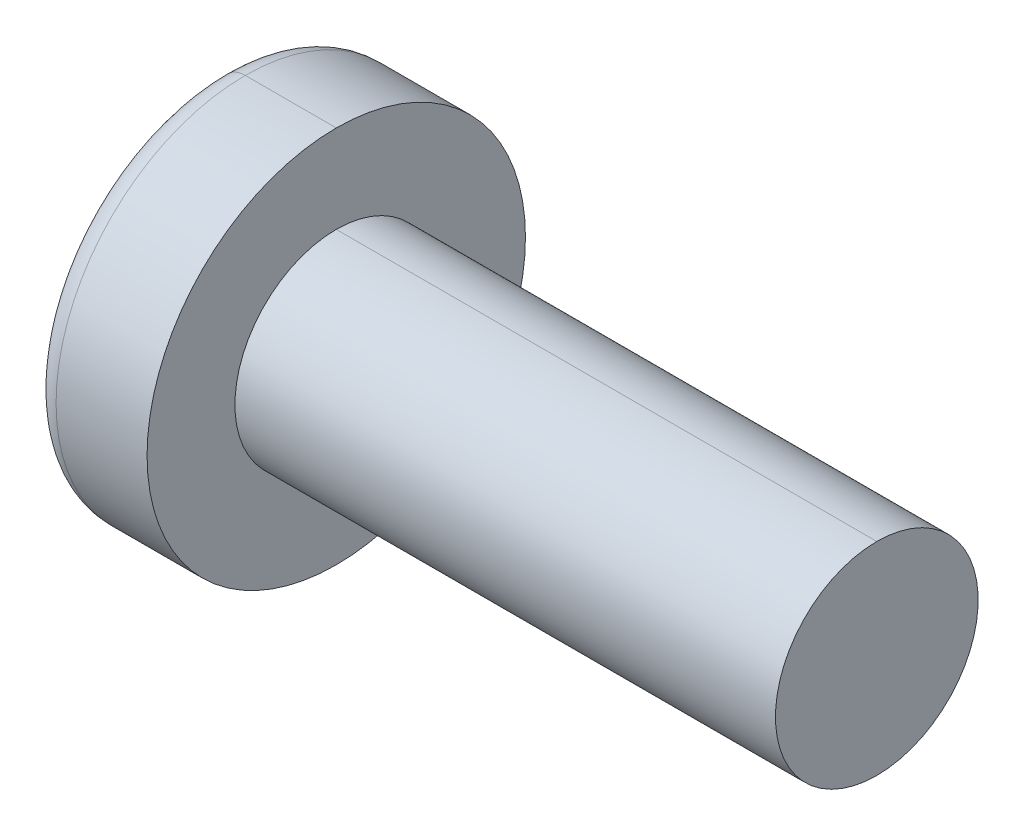
ISO-10303-21;
HEADER;
FILE_DESCRIPTION(('STEP AP214'),'2;1');
FILE_NAME('part.step','',(''),(''),'','','');
FILE_SCHEMA(('AUTOMOTIVE_DESIGN { 1 0 10303 214 1 1 1 1 }'));
ENDSEC;
DATA;
#1=APPLICATION_CONTEXT('core data for automotive mechanical design processes');
#2=APPLICATION_PROTOCOL_DEFINITION('international standard','automotive_design',2000,#1);
#3=PRODUCT_CONTEXT('',#1,'mechanical');
#4=PRODUCT('Part','Part','',(#3));
#5=PRODUCT_RELATED_PRODUCT_CATEGORY('part','',(#4));
#6=PRODUCT_DEFINITION_FORMATION('','',#4);
#7=PRODUCT_DEFINITION_CONTEXT('part definition',#1,'design');
#8=PRODUCT_DEFINITION('design','',#6,#7);
#9=PRODUCT_DEFINITION_SHAPE('','',#8);
#10=(LENGTH_UNIT() NAMED_UNIT(*) SI_UNIT(.MILLI.,.METRE.));
#11=(NAMED_UNIT(*) PLANE_ANGLE_UNIT() SI_UNIT($,.RADIAN.));
#12=(NAMED_UNIT(*) SI_UNIT($,.STERADIAN.) SOLID_ANGLE_UNIT());
#13=UNCERTAINTY_MEASURE_WITH_UNIT(LENGTH_MEASURE(1.E-05),#10,'distance_accuracy_value','');
#14=(GEOMETRIC_REPRESENTATION_CONTEXT(3) GLOBAL_UNCERTAINTY_ASSIGNED_CONTEXT((#13)) GLOBAL_UNIT_ASSIGNED_CONTEXT((#10,
#11,#12)) REPRESENTATION_CONTEXT('',''));
#15=CARTESIAN_POINT('',(0.,0.,0.));
#16=DIRECTION('',(0.,0.,1.));
#17=DIRECTION('',(1.,0.,0.));
#18=AXIS2_PLACEMENT_3D('',#15,#16,#17);
#19=CARTESIAN_POINT('',(-0.382608695652,0.,-0.157944664032));
#20=DIRECTION('',(-0.104537710695992,0.,0.994520923380922));
#21=DIRECTION('',(0.,1.,0.));
#22=AXIS2_PLACEMENT_3D('',#19,#20,#21);
#23=PLANE('',#22);
#24=DIRECTION('',(0.989130931836583,0.103971149084956,0.103971149084956));
#25=VECTOR('',#24,1.);
#26=CARTESIAN_POINT('',(-2.372965865668,-0.367158343834,-0.367158343834));
#27=LINE('',#26,#25);
#28=CARTESIAN_POINT('',(-2.372965865669,-0.367158343834,-0.367158343834));
#29=VERTEX_POINT('',#28);
#30=CARTESIAN_POINT('',(-0.639999999999,-0.185,-0.185));
#31=VERTEX_POINT('',#30);
#32=EDGE_CURVE('E11',#29,#31,#27,.T.);
#33=ORIENTED_EDGE('',*,*,#32,.F.);
#34=CARTESIAN_POINT('',(2.583826363223,0.,0.153868112042));
#35=DIRECTION('',(-0.10453771069617,0.,0.994520923380903));
#36=DIRECTION('',(-0.991833389461053,-0.073466848683124,-0.104255214233006));
#37=AXIS2_PLACEMENT_3D('',#34,#35,#36);
#38=CIRCLE('',#37,4.997605728503);
#39=CARTESIAN_POINT('',(-2.211403861538,-1.314446525481,-0.350175974082));
#40=VERTEX_POINT('',#39);
#41=EDGE_CURVE('E158',#29,#40,#38,.T.);
#42=ORIENTED_EDGE('',*,*,#41,.T.);
#43=DIRECTION('',(-0.80907355338871,-0.581521616497791,-0.0850446632820795));
#44=VECTOR('',#43,1.);
#45=CARTESIAN_POINT('',(-0.639999999999,-0.185,-0.185));
#46=LINE('',#45,#44);
#47=EDGE_CURVE('E161',#31,#40,#46,.T.);
#48=ORIENTED_EDGE('',*,*,#47,.F.);
#49=EDGE_LOOP('',(#33,#42,#48));
#50=FACE_BOUND('',#49,.T.);
#51=ADVANCED_FACE('F17',(#50),#23,.T.);
#52=CARTESIAN_POINT('',(-0.382608695652,-0.157944664032,0.));
#53=DIRECTION('',(-0.104537710695992,0.994520923380922,0.));
#54=DIRECTION('',(0.,0.,1.));
#55=AXIS2_PLACEMENT_3D('',#52,#53,#54);
#56=PLANE('',#55);
#57=DIRECTION('',(-0.80907355338871,-0.0850446632820795,-0.581521616497791));
#58=VECTOR('',#57,1.);
#59=CARTESIAN_POINT('',(-0.639999999999,-0.185,-0.185));
#60=LINE('',#59,#58);
#61=CARTESIAN_POINT('',(-2.211403861539,-0.350175974082,-1.314446525481));
#62=VERTEX_POINT('',#61);
#63=EDGE_CURVE('E251',#31,#62,#60,.T.);
#64=ORIENTED_EDGE('',*,*,#63,.T.);
#65=CARTESIAN_POINT('',(2.583826363223,0.153868112042,0.));
#66=DIRECTION('',(-0.104537710695979,0.994520923380923,0.));
#67=DIRECTION('',(-0.95950550829011,-0.100857113087012,-0.26301525108003));
#68=AXIS2_PLACEMENT_3D('',#65,#66,#67);
#69=CIRCLE('',#68,4.997605728503);
#70=EDGE_CURVE('E165',#62,#29,#69,.T.);
#71=ORIENTED_EDGE('',*,*,#70,.T.);
#72=ORIENTED_EDGE('',*,*,#32,.T.);
#73=EDGE_LOOP('',(#64,#71,#72));
#74=FACE_BOUND('',#73,.T.);
#75=ADVANCED_FACE('F330',(#74),#56,.T.);
#76=CARTESIAN_POINT('',(-0.382608695652,0.,-0.157944664032));
#77=DIRECTION('',(-0.104537710695992,0.,0.994520923380922));
#78=DIRECTION('',(0.,1.,0.));
#79=AXIS2_PLACEMENT_3D('',#76,#77,#78);
#80=PLANE('',#79);
#81=DIRECTION('',(-0.989130931836583,0.103971149084956,-0.103971149084956));
#82=VECTOR('',#81,1.);
#83=CARTESIAN_POINT('',(-0.639999999999,0.185,-0.185));
#84=LINE('',#83,#82);
#85=CARTESIAN_POINT('',(-0.639999999999,0.185,-0.185));
#86=VERTEX_POINT('',#85);
#87=CARTESIAN_POINT('',(-2.372965865669,0.367158343834,-0.367158343834));
#88=VERTEX_POINT('',#87);
#89=EDGE_CURVE('E28',#86,#88,#84,.T.);
#90=ORIENTED_EDGE('',*,*,#89,.F.);
#91=DIRECTION('',(-0.80907355338871,0.581521616497791,-0.0850446632820795));
#92=VECTOR('',#91,1.);
#93=CARTESIAN_POINT('',(-0.639999999999,0.185,-0.185));
#94=LINE('',#93,#92);
#95=CARTESIAN_POINT('',(-2.211403861539,1.314446525481,-0.350175974082));
#96=VERTEX_POINT('',#95);
#97=EDGE_CURVE('E238',#86,#96,#94,.T.);
#98=ORIENTED_EDGE('',*,*,#97,.T.);
#99=CARTESIAN_POINT('',(2.583826363223,0.,0.153868112042));
#100=DIRECTION('',(-0.104537710695979,0.,0.994520923380923));
#101=DIRECTION('',(-0.95950550829011,0.26301525108003,-0.100857113087012));
#102=AXIS2_PLACEMENT_3D('',#99,#100,#101);
#103=CIRCLE('',#102,4.997605728503);
#104=EDGE_CURVE('E237',#96,#88,#103,.T.);
#105=ORIENTED_EDGE('',*,*,#104,.T.);
#106=EDGE_LOOP('',(#90,#98,#105));
#107=FACE_BOUND('',#106,.T.);
#108=ADVANCED_FACE('F655',(#107),#80,.T.);
#109=CARTESIAN_POINT('',(-0.382608695652,0.157944664032,0.));
#110=DIRECTION('',(-0.104537710695992,-0.994520923380922,0.));
#111=DIRECTION('',(-0.994520923380922,0.104537710695992,0.));
#112=AXIS2_PLACEMENT_3D('',#109,#110,#111);
#113=PLANE('',#112);
#114=ORIENTED_EDGE('',*,*,#89,.T.);
#115=CARTESIAN_POINT('',(2.583826363223,-0.153868112042,0.));
#116=DIRECTION('',(-0.10453771069617,-0.994520923380903,0.));
#117=DIRECTION('',(-0.991833389461053,0.104255214233006,-0.073466848683124));
#118=AXIS2_PLACEMENT_3D('',#115,#116,#117);
#119=CIRCLE('',#118,4.997605728503);
#120=CARTESIAN_POINT('',(-2.211403861538,0.350175974082,-1.314446525481));
#121=VERTEX_POINT('',#120);
#122=EDGE_CURVE('E259',#88,#121,#119,.T.);
#123=ORIENTED_EDGE('',*,*,#122,.T.);
#124=DIRECTION('',(-0.809073553388711,0.0850446632820696,-0.581521616497792));
#125=VECTOR('',#124,1.);
#126=CARTESIAN_POINT('',(-0.639999999999,0.185,-0.185));
#127=LINE('',#126,#125);
#128=EDGE_CURVE('E254',#86,#121,#127,.T.);
#129=ORIENTED_EDGE('',*,*,#128,.F.);
#130=EDGE_LOOP('',(#114,#123,#129));
#131=FACE_BOUND('',#130,.T.);
#132=ADVANCED_FACE('F647',(#131),#113,.T.);
#133=CARTESIAN_POINT('',(-0.64,0.185,-0.185));
#134=DIRECTION('',(0.58363604815272,0.,-0.81201537134261));
#135=DIRECTION('',(0.,-1.,0.));
#136=AXIS2_PLACEMENT_3D('',#133,#134,#135);
#137=PLANE('',#136);
#138=ORIENTED_EDGE('',*,*,#63,.F.);
#139=DIRECTION('',(0.,-1.,0.));
#140=VECTOR('',#139,1.);
#141=CARTESIAN_POINT('',(-0.639999999999,0.185,-0.185));
#142=LINE('',#141,#140);
#143=EDGE_CURVE('E255',#86,#31,#142,.T.);
#144=ORIENTED_EDGE('',*,*,#143,.F.);
#145=ORIENTED_EDGE('',*,*,#128,.T.);
#146=CARTESIAN_POINT('',(1.58403090792,0.,1.413522215068));
#147=DIRECTION('',(0.58363604815272,0.,-0.81201537134261));
#148=DIRECTION('',(-0.809746087247413,-0.0747091287519981,-0.582005000209297));
#149=AXIS2_PLACEMENT_3D('',#146,#147,#148);
#150=CIRCLE('',#149,4.687191243319);
#151=EDGE_CURVE('E318',#62,#121,#150,.T.);
#152=ORIENTED_EDGE('',*,*,#151,.F.);
#153=EDGE_LOOP('',(#138,#144,#145,#152));
#154=FACE_BOUND('',#153,.T.);
#155=ADVANCED_FACE('F19',(#154),#137,.F.);
#156=CARTESIAN_POINT('',(-0.64,-0.185,-0.185));
#157=DIRECTION('',(1.,0.,0.));
#158=DIRECTION('',(0.,1.,0.));
#159=AXIS2_PLACEMENT_3D('',#156,#157,#158);
#160=PLANE('',#159);
#161=DIRECTION('',(0.,0.,-1.));
#162=VECTOR('',#161,1.);
#163=CARTESIAN_POINT('',(-0.639999999999,-0.185,0.185));
#164=LINE('',#163,#162);
#165=CARTESIAN_POINT('',(-0.639999999999,-0.185,0.185));
#166=VERTEX_POINT('',#165);
#167=EDGE_CURVE('E180',#166,#31,#164,.T.);
#168=ORIENTED_EDGE('',*,*,#167,.F.);
#169=DIRECTION('',(0.,1.,0.));
#170=VECTOR('',#169,1.);
#171=CARTESIAN_POINT('',(-0.639999999999,-0.185,0.185));
#172=LINE('',#171,#170);
#173=CARTESIAN_POINT('',(-0.639999999999,0.185,0.185));
#174=VERTEX_POINT('',#173);
#175=EDGE_CURVE('E42',#166,#174,#172,.T.);
#176=ORIENTED_EDGE('',*,*,#175,.T.);
#177=DIRECTION('',(0.,0.,1.));
#178=VECTOR('',#177,1.);
#179=CARTESIAN_POINT('',(-0.639999999999,0.185,-0.185));
#180=LINE('',#179,#178);
#181=EDGE_CURVE('E234',#86,#174,#180,.T.);
#182=ORIENTED_EDGE('',*,*,#181,.F.);
#183=ORIENTED_EDGE('',*,*,#143,.T.);
#184=EDGE_LOOP('',(#168,#176,#182,#183));
#185=FACE_BOUND('',#184,.T.);
#186=ADVANCED_FACE('F324',(#185),#160,.F.);
#187=CARTESIAN_POINT('',(-0.382608695652,0.,0.157944664032));
#188=DIRECTION('',(-0.104537710695992,0.,-0.994520923380922));
#189=DIRECTION('',(-0.994520923380922,0.,0.104537710695992));
#190=AXIS2_PLACEMENT_3D('',#187,#188,#189);
#191=PLANE('',#190);
#192=DIRECTION('',(-0.989130931836583,-0.103971149084956,0.103971149084956));
#193=VECTOR('',#192,1.);
#194=CARTESIAN_POINT('',(-0.639999999999,-0.185,0.185));
#195=LINE('',#194,#193);
#196=CARTESIAN_POINT('',(-2.372965865669,-0.367158343834,0.367158343834));
#197=VERTEX_POINT('',#196);
#198=EDGE_CURVE('E312',#166,#197,#195,.T.);
#199=ORIENTED_EDGE('',*,*,#198,.F.);
#200=DIRECTION('',(-0.80907355338871,-0.581521616497791,0.0850446632820795));
#201=VECTOR('',#200,1.);
#202=CARTESIAN_POINT('',(-0.639999999999,-0.185,0.185));
#203=LINE('',#202,#201);
#204=CARTESIAN_POINT('',(-2.211403861538,-1.314446525481,0.350175974082));
#205=VERTEX_POINT('',#204);
#206=EDGE_CURVE('E187',#166,#205,#203,.T.);
#207=ORIENTED_EDGE('',*,*,#206,.T.);
#208=CARTESIAN_POINT('',(2.583826363223,0.,-0.153868112042));
#209=DIRECTION('',(-0.104537710695979,0.,-0.994520923380923));
#210=DIRECTION('',(-0.95950550829011,-0.26301525108003,0.100857113087012));
#211=AXIS2_PLACEMENT_3D('',#208,#209,#210);
#212=CIRCLE('',#211,4.997605728503);
#213=EDGE_CURVE('E220',#205,#197,#212,.T.);
#214=ORIENTED_EDGE('',*,*,#213,.T.);
#215=EDGE_LOOP('',(#199,#207,#214));
#216=FACE_BOUND('',#215,.T.);
#217=ADVANCED_FACE('F368',(#216),#191,.T.);
#218=CARTESIAN_POINT('',(-0.382608695652,-0.157944664032,0.));
#219=DIRECTION('',(-0.104537710695992,0.994520923380922,0.));
#220=DIRECTION('',(0.,0.,1.));
#221=AXIS2_PLACEMENT_3D('',#218,#219,#220);
#222=PLANE('',#221);
#223=ORIENTED_EDGE('',*,*,#198,.T.);
#224=CARTESIAN_POINT('',(2.583826363223,0.153868112042,0.));
#225=DIRECTION('',(-0.10453771069617,0.994520923380903,0.));
#226=DIRECTION('',(-0.991833389461053,-0.104255214233006,0.073466848683124));
#227=AXIS2_PLACEMENT_3D('',#224,#225,#226);
#228=CIRCLE('',#227,4.997605728503);
#229=CARTESIAN_POINT('',(-2.211403861538,-0.350175974082,1.314446525481));
#230=VERTEX_POINT('',#229);
#231=EDGE_CURVE('E21',#197,#230,#228,.T.);
#232=ORIENTED_EDGE('',*,*,#231,.T.);
#233=DIRECTION('',(-0.809073553388711,-0.0850446632820696,0.581521616497792));
#234=VECTOR('',#233,1.);
#235=CARTESIAN_POINT('',(-0.639999999999,-0.185,0.185));
#236=LINE('',#235,#234);
#237=EDGE_CURVE('E249',#166,#230,#236,.T.);
#238=ORIENTED_EDGE('',*,*,#237,.F.);
#239=EDGE_LOOP('',(#223,#232,#238));
#240=FACE_BOUND('',#239,.T.);
#241=ADVANCED_FACE('F364',(#240),#222,.T.);
#242=CARTESIAN_POINT('',(-0.64,-0.185,0.185));
#243=DIRECTION('',(0.58363604815272,0.,0.81201537134261));
#244=DIRECTION('',(0.,-1.,0.));
#245=AXIS2_PLACEMENT_3D('',#242,#243,#244);
#246=PLANE('',#245);
#247=CARTESIAN_POINT('',(1.58403090792,0.,-1.413522215068));
#248=DIRECTION('',(0.58363604815272,0.,0.81201537134261));
#249=DIRECTION('',(-0.809746087247413,0.0747091287519981,0.582005000209297));
#250=AXIS2_PLACEMENT_3D('',#247,#248,#249);
#251=CIRCLE('',#250,4.687191243319);
#252=CARTESIAN_POINT('',(-2.211403861539,0.350175974082,1.314446525481));
#253=VERTEX_POINT('',#252);
#254=CARTESIAN_POINT('',(-2.222040430078,0.,1.322091559119));
#255=VERTEX_POINT('',#254);
#256=EDGE_CURVE('E206',#253,#255,#251,.T.);
#257=ORIENTED_EDGE('',*,*,#256,.F.);
#258=DIRECTION('',(-0.80907355338871,0.0850446632820795,0.581521616497791));
#259=VECTOR('',#258,1.);
#260=CARTESIAN_POINT('',(-0.639999999999,0.185,0.185));
#261=LINE('',#260,#259);
#262=EDGE_CURVE('E250',#174,#253,#261,.T.);
#263=ORIENTED_EDGE('',*,*,#262,.F.);
#264=ORIENTED_EDGE('',*,*,#175,.F.);
#265=ORIENTED_EDGE('',*,*,#237,.T.);
#266=CARTESIAN_POINT('',(1.58403090792,0.,-1.413522215068));
#267=DIRECTION('',(0.58363604815272,0.,0.81201537134261));
#268=DIRECTION('',(-0.81201537134261,0.,0.58363604815272));
#269=AXIS2_PLACEMENT_3D('',#266,#267,#268);
#270=CIRCLE('',#269,4.687191243319);
#271=EDGE_CURVE('E302',#255,#230,#270,.T.);
#272=ORIENTED_EDGE('',*,*,#271,.F.);
#273=EDGE_LOOP('',(#257,#263,#264,#265,#272));
#274=FACE_BOUND('',#273,.T.);
#275=ADVANCED_FACE('F606',(#274),#246,.F.);
#276=CARTESIAN_POINT('',(-0.382608695652,0.157944664032,0.));
#277=DIRECTION('',(-0.104537710695992,-0.994520923380922,0.));
#278=DIRECTION('',(-0.994520923380922,0.104537710695992,0.));
#279=AXIS2_PLACEMENT_3D('',#276,#277,#278);
#280=PLANE('',#279);
#281=ORIENTED_EDGE('',*,*,#262,.T.);
#282=CARTESIAN_POINT('',(2.583826363223,-0.153868112042,0.));
#283=DIRECTION('',(-0.104537710695979,-0.994520923380923,0.));
#284=DIRECTION('',(-0.95950550829011,0.100857113087012,0.26301525108003));
#285=AXIS2_PLACEMENT_3D('',#282,#283,#284);
#286=CIRCLE('',#285,4.997605728503);
#287=CARTESIAN_POINT('',(-2.372965865669,0.367158343834,0.367158343834));
#288=VERTEX_POINT('',#287);
#289=EDGE_CURVE('E203',#253,#288,#286,.T.);
#290=ORIENTED_EDGE('',*,*,#289,.T.);
#291=DIRECTION('',(0.989130931836583,-0.103971149084956,-0.103971149084956));
#292=VECTOR('',#291,1.);
#293=CARTESIAN_POINT('',(-2.372965865668,0.367158343834,0.367158343834));
#294=LINE('',#293,#292);
#295=EDGE_CURVE('E233',#288,#174,#294,.T.);
#296=ORIENTED_EDGE('',*,*,#295,.T.);
#297=EDGE_LOOP('',(#281,#290,#296));
#298=FACE_BOUND('',#297,.T.);
#299=ADVANCED_FACE('F597',(#298),#280,.T.);
#300=CARTESIAN_POINT('',(-0.382608695652,0.,0.157944664032));
#301=DIRECTION('',(-0.104537710695992,0.,-0.994520923380922));
#302=DIRECTION('',(-0.994520923380922,0.,0.104537710695992));
#303=AXIS2_PLACEMENT_3D('',#300,#301,#302);
#304=PLANE('',#303);
#305=ORIENTED_EDGE('',*,*,#295,.F.);
#306=CARTESIAN_POINT('',(2.583826363223,0.,-0.153868112042));
#307=DIRECTION('',(-0.10453771069617,0.,-0.994520923380903));
#308=DIRECTION('',(-0.991833389461053,0.073466848683124,0.104255214233006));
#309=AXIS2_PLACEMENT_3D('',#306,#307,#308);
#310=CIRCLE('',#309,4.997605728503);
#311=CARTESIAN_POINT('',(-2.211403861538,1.314446525481,0.350175974082));
#312=VERTEX_POINT('',#311);
#313=EDGE_CURVE('E207',#288,#312,#310,.T.);
#314=ORIENTED_EDGE('',*,*,#313,.T.);
#315=DIRECTION('',(-0.80907355338871,0.581521616497791,0.0850446632820795));
#316=VECTOR('',#315,1.);
#317=CARTESIAN_POINT('',(-0.639999999999,0.185,0.185));
#318=LINE('',#317,#316);
#319=EDGE_CURVE('E88',#174,#312,#318,.T.);
#320=ORIENTED_EDGE('',*,*,#319,.F.);
#321=EDGE_LOOP('',(#305,#314,#320));
#322=FACE_BOUND('',#321,.T.);
#323=ADVANCED_FACE('F588',(#322),#304,.T.);
#324=CARTESIAN_POINT('',(-0.64,0.185,0.185));
#325=DIRECTION('',(0.58363604815272,0.81201537134261,0.));
#326=DIRECTION('',(0.,0.,-1.));
#327=AXIS2_PLACEMENT_3D('',#324,#325,#326);
#328=PLANE('',#327);
#329=CARTESIAN_POINT('',(1.58403090792,-1.413522215068,0.));
#330=DIRECTION('',(0.58363604815272,0.81201537134261,0.));
#331=DIRECTION('',(-0.809746087247413,0.582005000209297,-0.0747091287519981));
#332=AXIS2_PLACEMENT_3D('',#329,#330,#331);
#333=CIRCLE('',#332,4.687191243319);
#334=CARTESIAN_POINT('',(-2.222040430078,1.322091559119,0.));
#335=VERTEX_POINT('',#334);
#336=EDGE_CURVE('E76',#96,#335,#333,.T.);
#337=ORIENTED_EDGE('',*,*,#336,.F.);
#338=ORIENTED_EDGE('',*,*,#97,.F.);
#339=ORIENTED_EDGE('',*,*,#181,.T.);
#340=ORIENTED_EDGE('',*,*,#319,.T.);
#341=CARTESIAN_POINT('',(1.58403090792,-1.413522215068,0.));
#342=DIRECTION('',(0.58363604815272,0.81201537134261,0.));
#343=DIRECTION('',(-0.81201537134261,0.58363604815272,0.));
#344=AXIS2_PLACEMENT_3D('',#341,#342,#343);
#345=CIRCLE('',#344,4.687191243319);
#346=EDGE_CURVE('E219',#335,#312,#345,.T.);
#347=ORIENTED_EDGE('',*,*,#346,.F.);
#348=EDGE_LOOP('',(#337,#338,#339,#340,#347));
#349=FACE_BOUND('',#348,.T.);
#350=ADVANCED_FACE('F323',(#349),#328,.F.);
#351=CARTESIAN_POINT('',(8.,1.5,0.));
#352=DIRECTION('',(-1.,0.,0.));
#353=DIRECTION('',(0.,0.,1.));
#354=AXIS2_PLACEMENT_3D('',#351,#352,#353);
#355=PLANE('',#354);
#356=CARTESIAN_POINT('',(8.,0.,0.));
#357=DIRECTION('',(1.,0.,0.));
#358=DIRECTION('',(0.,-1.,0.));
#359=AXIS2_PLACEMENT_3D('',#356,#357,#358);
#360=CIRCLE('',#359,1.5);
#361=CARTESIAN_POINT('',(8.,-1.5,0.));
#362=VERTEX_POINT('',#361);
#363=CARTESIAN_POINT('',(8.,1.5,0.));
#364=VERTEX_POINT('',#363);
#365=EDGE_CURVE('E242',#362,#364,#360,.T.);
#366=ORIENTED_EDGE('',*,*,#365,.T.);
#367=CARTESIAN_POINT('',(8.,0.,0.));
#368=DIRECTION('',(1.,0.,0.));
#369=DIRECTION('',(0.,1.,0.));
#370=AXIS2_PLACEMENT_3D('',#367,#368,#369);
#371=CIRCLE('',#370,1.5);
#372=EDGE_CURVE('E196',#364,#362,#371,.T.);
#373=ORIENTED_EDGE('',*,*,#372,.T.);
#374=EDGE_LOOP('',(#366,#373));
#375=FACE_BOUND('',#374,.T.);
#376=ADVANCED_FACE('F569',(#375),#355,.F.);
#377=CARTESIAN_POINT('',(8.,0.,0.));
#378=DIRECTION('',(1.,0.,0.));
#379=DIRECTION('',(0.,1.,0.));
#380=AXIS2_PLACEMENT_3D('',#377,#378,#379);
#381=CYLINDRICAL_SURFACE('',#380,1.5);
#382=CARTESIAN_POINT('',(0.,0.,0.));
#383=DIRECTION('',(-1.,0.,0.));
#384=DIRECTION('',(0.,1.,0.));
#385=AXIS2_PLACEMENT_3D('',#382,#383,#384);
#386=CIRCLE('',#385,1.5);
#387=CARTESIAN_POINT('',(0.,1.5,0.));
#388=VERTEX_POINT('',#387);
#389=CARTESIAN_POINT('',(0.,-1.5,0.));
#390=VERTEX_POINT('',#389);
#391=EDGE_CURVE('E212',#388,#390,#386,.T.);
#392=ORIENTED_EDGE('',*,*,#391,.F.);
#393=DIRECTION('',(-1.,0.,0.));
#394=VECTOR('',#393,1.);
#395=CARTESIAN_POINT('',(8.,1.5,0.));
#396=LINE('',#395,#394);
#397=EDGE_CURVE('E246',#364,#388,#396,.T.);
#398=ORIENTED_EDGE('',*,*,#397,.F.);
#399=ORIENTED_EDGE('',*,*,#365,.F.);
#400=DIRECTION('',(-1.,0.,0.));
#401=VECTOR('',#400,1.);
#402=CARTESIAN_POINT('',(8.,-1.5,0.));
#403=LINE('',#402,#401);
#404=EDGE_CURVE('E192',#362,#390,#403,.T.);
#405=ORIENTED_EDGE('',*,*,#404,.T.);
#406=EDGE_LOOP('',(#392,#398,#399,#405));
#407=FACE_BOUND('',#406,.T.);
#408=ADVANCED_FACE('F560',(#407),#381,.T.);
#409=CARTESIAN_POINT('',(8.,0.,0.));
#410=DIRECTION('',(1.,0.,0.));
#411=DIRECTION('',(0.,1.,0.));
#412=AXIS2_PLACEMENT_3D('',#409,#410,#411);
#413=CYLINDRICAL_SURFACE('',#412,1.5);
#414=ORIENTED_EDGE('',*,*,#404,.F.);
#415=ORIENTED_EDGE('',*,*,#372,.F.);
#416=ORIENTED_EDGE('',*,*,#397,.T.);
#417=CARTESIAN_POINT('',(0.,0.,0.));
#418=DIRECTION('',(-1.,0.,0.));
#419=DIRECTION('',(0.,-1.,0.));
#420=AXIS2_PLACEMENT_3D('',#417,#418,#419);
#421=CIRCLE('',#420,1.5);
#422=EDGE_CURVE('E197',#390,#388,#421,.T.);
#423=ORIENTED_EDGE('',*,*,#422,.F.);
#424=EDGE_LOOP('',(#414,#415,#416,#423));
#425=FACE_BOUND('',#424,.T.);
#426=ADVANCED_FACE('F550',(#425),#413,.T.);
#427=CARTESIAN_POINT('',(0.,1.5,0.));
#428=DIRECTION('',(1.,0.,0.));
#429=DIRECTION('',(0.,1.,0.));
#430=AXIS2_PLACEMENT_3D('',#427,#428,#429);
#431=PLANE('',#430);
#432=ORIENTED_EDGE('',*,*,#391,.T.);
#433=ORIENTED_EDGE('',*,*,#422,.T.);
#434=EDGE_LOOP('',(#432,#433));
#435=FACE_BOUND('',#434,.T.);
#436=CARTESIAN_POINT('',(0.,0.,0.));
#437=DIRECTION('',(1.,0.,0.));
#438=DIRECTION('',(0.,-1.,0.));
#439=AXIS2_PLACEMENT_3D('',#436,#437,#438);
#440=CIRCLE('',#439,2.8);
#441=CARTESIAN_POINT('',(0.,-2.8,0.));
#442=VERTEX_POINT('',#441);
#443=CARTESIAN_POINT('',(0.,2.8,0.));
#444=VERTEX_POINT('',#443);
#445=EDGE_CURVE('E260',#442,#444,#440,.T.);
#446=ORIENTED_EDGE('',*,*,#445,.T.);
#447=CARTESIAN_POINT('',(0.,0.,0.));
#448=DIRECTION('',(1.,0.,0.));
#449=DIRECTION('',(0.,1.,0.));
#450=AXIS2_PLACEMENT_3D('',#447,#448,#449);
#451=CIRCLE('',#450,2.8);
#452=EDGE_CURVE('E216',#444,#442,#451,.T.);
#453=ORIENTED_EDGE('',*,*,#452,.T.);
#454=EDGE_LOOP('',(#446,#453));
#455=FACE_BOUND('',#454,.T.);
#456=ADVANCED_FACE('F540',(#435,#455),#431,.T.);
#457=CARTESIAN_POINT('',(8.,0.,0.));
#458=DIRECTION('',(1.,0.,0.));
#459=DIRECTION('',(0.,1.,0.));
#460=AXIS2_PLACEMENT_3D('',#457,#458,#459);
#461=CYLINDRICAL_SURFACE('',#460,2.8);
#462=DIRECTION('',(-1.,0.,0.));
#463=VECTOR('',#462,1.);
#464=CARTESIAN_POINT('',(0.,-2.8,0.));
#465=LINE('',#464,#463);
#466=CARTESIAN_POINT('',(-1.34664414408,-2.8,0.));
#467=VERTEX_POINT('',#466);
#468=EDGE_CURVE('E264',#442,#467,#465,.T.);
#469=ORIENTED_EDGE('',*,*,#468,.F.);
#470=ORIENTED_EDGE('',*,*,#452,.F.);
#471=DIRECTION('',(-1.,0.,0.));
#472=VECTOR('',#471,1.);
#473=CARTESIAN_POINT('',(0.,2.8,0.));
#474=LINE('',#473,#472);
#475=CARTESIAN_POINT('',(-1.34664414408,2.8,0.));
#476=VERTEX_POINT('',#475);
#477=EDGE_CURVE('E229',#444,#476,#474,.T.);
#478=ORIENTED_EDGE('',*,*,#477,.T.);
#479=CARTESIAN_POINT('',(-1.34664414408,0.,0.));
#480=DIRECTION('',(-1.,0.,0.));
#481=DIRECTION('',(0.,-1.,0.));
#482=AXIS2_PLACEMENT_3D('',#479,#480,#481);
#483=CIRCLE('',#482,2.8);
#484=EDGE_CURVE('E294',#467,#476,#483,.T.);
#485=ORIENTED_EDGE('',*,*,#484,.F.);
#486=EDGE_LOOP('',(#469,#470,#478,#485));
#487=FACE_BOUND('',#486,.T.);
#488=ADVANCED_FACE('F529',(#487),#461,.T.);
#489=CARTESIAN_POINT('',(8.,0.,0.));
#490=DIRECTION('',(1.,0.,0.));
#491=DIRECTION('',(0.,1.,0.));
#492=AXIS2_PLACEMENT_3D('',#489,#490,#491);
#493=CYLINDRICAL_SURFACE('',#492,2.8);
#494=CARTESIAN_POINT('',(-1.34664414408,0.,0.));
#495=DIRECTION('',(-1.,0.,0.));
#496=DIRECTION('',(0.,1.,0.));
#497=AXIS2_PLACEMENT_3D('',#494,#495,#496);
#498=CIRCLE('',#497,2.8);
#499=EDGE_CURVE('E225',#476,#467,#498,.T.);
#500=ORIENTED_EDGE('',*,*,#499,.F.);
#501=ORIENTED_EDGE('',*,*,#477,.F.);
#502=ORIENTED_EDGE('',*,*,#445,.F.);
#503=ORIENTED_EDGE('',*,*,#468,.T.);
#504=EDGE_LOOP('',(#500,#501,#502,#503));
#505=FACE_BOUND('',#504,.T.);
#506=ADVANCED_FACE('F520',(#505),#493,.T.);
#507=CARTESIAN_POINT('',(-1.34664414408,0.,0.));
#508=DIRECTION('',(1.,0.,0.));
#509=DIRECTION('',(0.,1.,0.));
#510=AXIS2_PLACEMENT_3D('',#507,#508,#509);
#511=TOROIDAL_SURFACE('',#510,2.44,0.36);
#512=CARTESIAN_POINT('',(-1.65284929319,0.,0.));
#513=DIRECTION('',(-1.,0.,0.));
#514=DIRECTION('',(0.,1.,0.));
#515=AXIS2_PLACEMENT_3D('',#512,#513,#514);
#516=CIRCLE('',#515,2.629310344828);
#517=CARTESIAN_POINT('',(-1.65284929319,2.629310344828,0.));
#518=VERTEX_POINT('',#517);
#519=CARTESIAN_POINT('',(-1.65284929319,-2.629310344828,0.));
#520=VERTEX_POINT('',#519);
#521=EDGE_CURVE('E230',#518,#520,#516,.T.);
#522=ORIENTED_EDGE('',*,*,#521,.F.);
#523=CARTESIAN_POINT('',(-1.34664414408,2.44,0.));
#524=DIRECTION('',(0.,0.,1.));
#525=DIRECTION('',(0.,1.,0.));
#526=AXIS2_PLACEMENT_3D('',#523,#524,#525);
#527=CIRCLE('',#526,0.36);
#528=EDGE_CURVE('E202',#476,#518,#527,.T.);
#529=ORIENTED_EDGE('',*,*,#528,.F.);
#530=ORIENTED_EDGE('',*,*,#499,.T.);
#531=CARTESIAN_POINT('',(-1.34664414408,-2.44,0.));
#532=DIRECTION('',(0.,0.,-1.));
#533=DIRECTION('',(0.,-1.,0.));
#534=AXIS2_PLACEMENT_3D('',#531,#532,#533);
#535=CIRCLE('',#534,0.36);
#536=EDGE_CURVE('E289',#467,#520,#535,.T.);
#537=ORIENTED_EDGE('',*,*,#536,.T.);
#538=EDGE_LOOP('',(#522,#529,#530,#537));
#539=FACE_BOUND('',#538,.T.);
#540=ADVANCED_FACE('F290',(#539),#511,.T.);
#541=CARTESIAN_POINT('',(2.6,0.,0.));
#542=DIRECTION('',(0.,0.,1.));
#543=DIRECTION('',(0.,1.,0.));
#544=AXIS2_PLACEMENT_3D('',#541,#542,#543);
#545=SPHERICAL_SURFACE('',#544,5.);
#546=CARTESIAN_POINT('',(1.58403090792,1.413522215068,0.));
#547=DIRECTION('',(0.58363604815272,-0.81201537134261,0.));
#548=DIRECTION('',(-0.81201537134261,-0.58363604815272,0.));
#549=AXIS2_PLACEMENT_3D('',#546,#547,#548);
#550=CIRCLE('',#549,4.687191243319);
#551=CARTESIAN_POINT('',(-2.222040430078,-1.322091559119,0.));
#552=VERTEX_POINT('',#551);
#553=EDGE_CURVE('E166',#552,#40,#550,.T.);
#554=ORIENTED_EDGE('',*,*,#553,.T.);
#555=ORIENTED_EDGE('',*,*,#41,.F.);
#556=ORIENTED_EDGE('',*,*,#70,.F.);
#557=ORIENTED_EDGE('',*,*,#151,.T.);
#558=ORIENTED_EDGE('',*,*,#122,.F.);
#559=ORIENTED_EDGE('',*,*,#104,.F.);
#560=ORIENTED_EDGE('',*,*,#336,.T.);
#561=CARTESIAN_POINT('',(2.6,0.,0.));
#562=DIRECTION('',(0.,0.,1.));
#563=DIRECTION('',(-0.850569858637715,0.525862068965824,0.));
#564=AXIS2_PLACEMENT_3D('',#561,#562,#563);
#565=CIRCLE('',#564,5.);
#566=EDGE_CURVE('E191',#518,#335,#565,.T.);
#567=ORIENTED_EDGE('',*,*,#566,.F.);
#568=ORIENTED_EDGE('',*,*,#521,.T.);
#569=CARTESIAN_POINT('',(2.6,0.,0.));
#570=DIRECTION('',(0.,0.,-1.));
#571=DIRECTION('',(-0.850569858637715,-0.525862068965824,0.));
#572=AXIS2_PLACEMENT_3D('',#569,#570,#571);
#573=CIRCLE('',#572,5.);
#574=EDGE_CURVE('E172',#520,#552,#573,.T.);
#575=ORIENTED_EDGE('',*,*,#574,.T.);
#576=EDGE_LOOP('',(#554,#555,#556,#557,#558,#559,#560,#567,#568,#575));
#577=FACE_BOUND('',#576,.T.);
#578=ADVANCED_FACE('F169',(#577),#545,.T.);
#579=CARTESIAN_POINT('',(-0.64,-0.185,-0.185));
#580=DIRECTION('',(0.58363604815272,-0.81201537134261,0.));
#581=DIRECTION('',(0.,0.,-1.));
#582=AXIS2_PLACEMENT_3D('',#579,#580,#581);
#583=PLANE('',#582);
#584=CARTESIAN_POINT('',(1.58403090792,1.413522215068,0.));
#585=DIRECTION('',(0.58363604815272,-0.81201537134261,0.));
#586=DIRECTION('',(-0.809746087247413,-0.582005000209297,0.0747091287519981));
#587=AXIS2_PLACEMENT_3D('',#584,#585,#586);
#588=CIRCLE('',#587,4.687191243319);
#589=EDGE_CURVE('E224',#205,#552,#588,.T.);
#590=ORIENTED_EDGE('',*,*,#589,.F.);
#591=ORIENTED_EDGE('',*,*,#206,.F.);
#592=ORIENTED_EDGE('',*,*,#167,.T.);
#593=ORIENTED_EDGE('',*,*,#47,.T.);
#594=ORIENTED_EDGE('',*,*,#553,.F.);
#595=EDGE_LOOP('',(#590,#591,#592,#593,#594));
#596=FACE_BOUND('',#595,.T.);
#597=ADVANCED_FACE('F178',(#596),#583,.F.);
#598=CARTESIAN_POINT('',(2.6,0.,0.));
#599=DIRECTION('',(0.,0.,1.));
#600=DIRECTION('',(0.,1.,0.));
#601=AXIS2_PLACEMENT_3D('',#598,#599,#600);
#602=SPHERICAL_SURFACE('',#601,5.);
#603=ORIENTED_EDGE('',*,*,#574,.F.);
#604=CARTESIAN_POINT('',(-1.65284929319,0.,0.));
#605=DIRECTION('',(-1.,0.,0.));
#606=DIRECTION('',(0.,-1.,0.));
#607=AXIS2_PLACEMENT_3D('',#604,#605,#606);
#608=CIRCLE('',#607,2.629310344828);
#609=EDGE_CURVE('E198',#520,#518,#608,.T.);
#610=ORIENTED_EDGE('',*,*,#609,.T.);
#611=ORIENTED_EDGE('',*,*,#566,.T.);
#612=ORIENTED_EDGE('',*,*,#346,.T.);
#613=ORIENTED_EDGE('',*,*,#313,.F.);
#614=ORIENTED_EDGE('',*,*,#289,.F.);
#615=ORIENTED_EDGE('',*,*,#256,.T.);
#616=ORIENTED_EDGE('',*,*,#271,.T.);
#617=ORIENTED_EDGE('',*,*,#231,.F.);
#618=ORIENTED_EDGE('',*,*,#213,.F.);
#619=ORIENTED_EDGE('',*,*,#589,.T.);
#620=EDGE_LOOP('',(#603,#610,#611,#612,#613,#614,#615,#616,#617,#618,#619));
#621=FACE_BOUND('',#620,.T.);
#622=ADVANCED_FACE('F280',(#621),#602,.T.);
#623=CARTESIAN_POINT('',(-1.34664414408,0.,0.));
#624=DIRECTION('',(1.,0.,0.));
#625=DIRECTION('',(0.,1.,0.));
#626=AXIS2_PLACEMENT_3D('',#623,#624,#625);
#627=TOROIDAL_SURFACE('',#626,2.44,0.36);
#628=ORIENTED_EDGE('',*,*,#536,.F.);
#629=ORIENTED_EDGE('',*,*,#484,.T.);
#630=ORIENTED_EDGE('',*,*,#528,.T.);
#631=ORIENTED_EDGE('',*,*,#609,.F.);
#632=EDGE_LOOP('',(#628,#629,#630,#631));
#633=FACE_BOUND('',#632,.T.);
#634=ADVANCED_FACE('F287',(#633),#627,.T.);
#635=CLOSED_SHELL('',(#51,#75,#108,#132,#155,#186,#217,#241,#275,#299,#323,#350,#376,#408,#426,
#456,#488,#506,#540,#578,#597,#622,#634));
#636=MANIFOLD_SOLID_BREP('B1',#635);
#637=ADVANCED_BREP_SHAPE_REPRESENTATION('',(#18,#636),#14);
#638=SHAPE_DEFINITION_REPRESENTATION(#9,#637);
ENDSEC;
END-ISO-10303-21;
